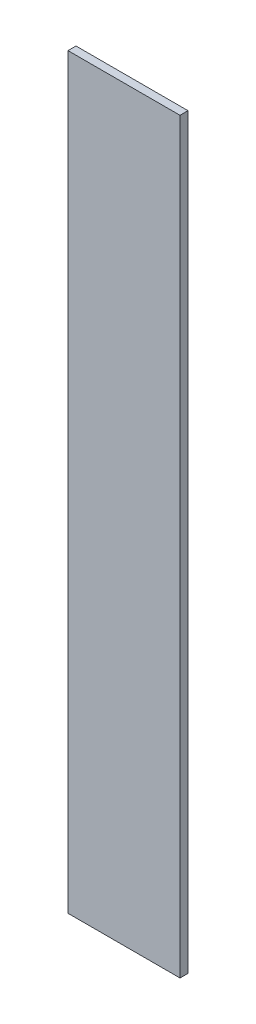
ISO-10303-21;
HEADER;
FILE_DESCRIPTION(('STEP AP214'),'2;1');
FILE_NAME('part.step','',(''),(''),'','','');
FILE_SCHEMA(('AUTOMOTIVE_DESIGN { 1 0 10303 214 1 1 1 1 }'));
ENDSEC;
DATA;
#1=APPLICATION_CONTEXT('core data for automotive mechanical design processes');
#2=APPLICATION_PROTOCOL_DEFINITION('international standard','automotive_design',2000,#1);
#3=PRODUCT_CONTEXT('',#1,'mechanical');
#4=PRODUCT('Part','Part','',(#3));
#5=PRODUCT_RELATED_PRODUCT_CATEGORY('part','',(#4));
#6=PRODUCT_DEFINITION_FORMATION('','',#4);
#7=PRODUCT_DEFINITION_CONTEXT('part definition',#1,'design');
#8=PRODUCT_DEFINITION('design','',#6,#7);
#9=PRODUCT_DEFINITION_SHAPE('','',#8);
#10=(LENGTH_UNIT() NAMED_UNIT(*) SI_UNIT(.MILLI.,.METRE.));
#11=(NAMED_UNIT(*) PLANE_ANGLE_UNIT() SI_UNIT($,.RADIAN.));
#12=(NAMED_UNIT(*) SI_UNIT($,.STERADIAN.) SOLID_ANGLE_UNIT());
#13=UNCERTAINTY_MEASURE_WITH_UNIT(LENGTH_MEASURE(1.E-05),#10,'distance_accuracy_value','');
#14=(GEOMETRIC_REPRESENTATION_CONTEXT(3) GLOBAL_UNCERTAINTY_ASSIGNED_CONTEXT((#13)) GLOBAL_UNIT_ASSIGNED_CONTEXT((#10,
#11,#12)) REPRESENTATION_CONTEXT('',''));
#15=CARTESIAN_POINT('',(0.,0.,0.));
#16=DIRECTION('',(0.,0.,1.));
#17=DIRECTION('',(1.,0.,0.));
#18=AXIS2_PLACEMENT_3D('',#15,#16,#17);
#19=CARTESIAN_POINT('',(0.,0.,6.35));
#20=DIRECTION('',(0.,1.,0.));
#21=DIRECTION('',(0.,0.,1.));
#22=AXIS2_PLACEMENT_3D('',#19,#20,#21);
#23=PLANE('',#22);
#24=DIRECTION('',(1.,0.,0.));
#25=VECTOR('',#24,1.);
#26=CARTESIAN_POINT('',(0.,0.,0.));
#27=LINE('',#26,#25);
#28=CARTESIAN_POINT('',(-88.9,0.,0.));
#29=VERTEX_POINT('',#28);
#30=CARTESIAN_POINT('',(0.,0.,0.));
#31=VERTEX_POINT('',#30);
#32=EDGE_CURVE('E113',#29,#31,#27,.T.);
#33=ORIENTED_EDGE('',*,*,#32,.T.);
#34=DIRECTION('',(0.,0.,-1.));
#35=VECTOR('',#34,1.);
#36=CARTESIAN_POINT('',(0.,0.,6.35));
#37=LINE('',#36,#35);
#38=CARTESIAN_POINT('',(0.,0.,6.35));
#39=VERTEX_POINT('',#38);
#40=EDGE_CURVE('E11',#39,#31,#37,.T.);
#41=ORIENTED_EDGE('',*,*,#40,.F.);
#42=DIRECTION('',(1.,0.,0.));
#43=VECTOR('',#42,1.);
#44=CARTESIAN_POINT('',(0.,0.,6.35));
#45=LINE('',#44,#43);
#46=CARTESIAN_POINT('',(-88.9,0.,6.35));
#47=VERTEX_POINT('',#46);
#48=EDGE_CURVE('E97',#47,#39,#45,.T.);
#49=ORIENTED_EDGE('',*,*,#48,.F.);
#50=DIRECTION('',(0.,0.,-1.));
#51=VECTOR('',#50,1.);
#52=CARTESIAN_POINT('',(-88.9,0.,6.35));
#53=LINE('',#52,#51);
#54=EDGE_CURVE('E109',#47,#29,#53,.T.);
#55=ORIENTED_EDGE('',*,*,#54,.T.);
#56=EDGE_LOOP('',(#33,#41,#49,#55));
#57=FACE_BOUND('',#56,.T.);
#58=ADVANCED_FACE('F45',(#57),#23,.F.);
#59=CARTESIAN_POINT('',(0.,0.,6.35));
#60=DIRECTION('',(-1.,0.,0.));
#61=DIRECTION('',(0.,0.,1.));
#62=AXIS2_PLACEMENT_3D('',#59,#60,#61);
#63=PLANE('',#62);
#64=DIRECTION('',(0.,1.,0.));
#65=VECTOR('',#64,1.);
#66=CARTESIAN_POINT('',(0.,0.,0.));
#67=LINE('',#66,#65);
#68=CARTESIAN_POINT('',(0.,593.09,0.));
#69=VERTEX_POINT('',#68);
#70=EDGE_CURVE('E102',#31,#69,#67,.T.);
#71=ORIENTED_EDGE('',*,*,#70,.T.);
#72=DIRECTION('',(0.,0.,-1.));
#73=VECTOR('',#72,1.);
#74=CARTESIAN_POINT('',(0.,593.09,6.35));
#75=LINE('',#74,#73);
#76=CARTESIAN_POINT('',(0.,593.09,6.35));
#77=VERTEX_POINT('',#76);
#78=EDGE_CURVE('E54',#77,#69,#75,.T.);
#79=ORIENTED_EDGE('',*,*,#78,.F.);
#80=DIRECTION('',(0.,1.,0.));
#81=VECTOR('',#80,1.);
#82=CARTESIAN_POINT('',(0.,0.,6.35));
#83=LINE('',#82,#81);
#84=EDGE_CURVE('E92',#39,#77,#83,.T.);
#85=ORIENTED_EDGE('',*,*,#84,.F.);
#86=ORIENTED_EDGE('',*,*,#40,.T.);
#87=EDGE_LOOP('',(#71,#79,#85,#86));
#88=FACE_BOUND('',#87,.T.);
#89=ADVANCED_FACE('F101',(#88),#63,.F.);
#90=CARTESIAN_POINT('',(0.,593.09,6.35));
#91=DIRECTION('',(0.,-1.,0.));
#92=DIRECTION('',(0.,0.,-1.));
#93=AXIS2_PLACEMENT_3D('',#90,#91,#92);
#94=PLANE('',#93);
#95=DIRECTION('',(-1.,0.,0.));
#96=VECTOR('',#95,1.);
#97=CARTESIAN_POINT('',(0.,593.09,0.));
#98=LINE('',#97,#96);
#99=CARTESIAN_POINT('',(-88.9,593.09,0.));
#100=VERTEX_POINT('',#99);
#101=EDGE_CURVE('E79',#69,#100,#98,.T.);
#102=ORIENTED_EDGE('',*,*,#101,.T.);
#103=DIRECTION('',(0.,0.,-1.));
#104=VECTOR('',#103,1.);
#105=CARTESIAN_POINT('',(-88.9,593.09,6.35));
#106=LINE('',#105,#104);
#107=CARTESIAN_POINT('',(-88.9,593.09,6.35));
#108=VERTEX_POINT('',#107);
#109=EDGE_CURVE('E104',#108,#100,#106,.T.);
#110=ORIENTED_EDGE('',*,*,#109,.F.);
#111=DIRECTION('',(-1.,0.,0.));
#112=VECTOR('',#111,1.);
#113=CARTESIAN_POINT('',(0.,593.09,6.35));
#114=LINE('',#113,#112);
#115=EDGE_CURVE('E95',#77,#108,#114,.T.);
#116=ORIENTED_EDGE('',*,*,#115,.F.);
#117=ORIENTED_EDGE('',*,*,#78,.T.);
#118=EDGE_LOOP('',(#102,#110,#116,#117));
#119=FACE_BOUND('',#118,.T.);
#120=ADVANCED_FACE('F105',(#119),#94,.F.);
#121=CARTESIAN_POINT('',(-88.9,0.,6.35));
#122=DIRECTION('',(1.,0.,0.));
#123=DIRECTION('',(0.,0.,-1.));
#124=AXIS2_PLACEMENT_3D('',#121,#122,#123);
#125=PLANE('',#124);
#126=DIRECTION('',(0.,-1.,0.));
#127=VECTOR('',#126,1.);
#128=CARTESIAN_POINT('',(-88.9,0.,0.));
#129=LINE('',#128,#127);
#130=EDGE_CURVE('E85',#100,#29,#129,.T.);
#131=ORIENTED_EDGE('',*,*,#130,.T.);
#132=ORIENTED_EDGE('',*,*,#54,.F.);
#133=DIRECTION('',(0.,-1.,0.));
#134=VECTOR('',#133,1.);
#135=CARTESIAN_POINT('',(-88.9,0.,6.35));
#136=LINE('',#135,#134);
#137=EDGE_CURVE('E62',#108,#47,#136,.T.);
#138=ORIENTED_EDGE('',*,*,#137,.F.);
#139=ORIENTED_EDGE('',*,*,#109,.T.);
#140=EDGE_LOOP('',(#131,#132,#138,#139));
#141=FACE_BOUND('',#140,.T.);
#142=ADVANCED_FACE('F126',(#141),#125,.F.);
#143=CARTESIAN_POINT('',(0.,0.,6.35));
#144=DIRECTION('',(0.,0.,-1.));
#145=DIRECTION('',(-1.,0.,0.));
#146=AXIS2_PLACEMENT_3D('',#143,#144,#145);
#147=PLANE('',#146);
#148=ORIENTED_EDGE('',*,*,#48,.T.);
#149=ORIENTED_EDGE('',*,*,#84,.T.);
#150=ORIENTED_EDGE('',*,*,#115,.T.);
#151=ORIENTED_EDGE('',*,*,#137,.T.);
#152=EDGE_LOOP('',(#148,#149,#150,#151));
#153=FACE_BOUND('',#152,.T.);
#154=ADVANCED_FACE('F93',(#153),#147,.F.);
#155=CARTESIAN_POINT('',(0.,0.,0.));
#156=DIRECTION('',(0.,0.,-1.));
#157=DIRECTION('',(-1.,0.,0.));
#158=AXIS2_PLACEMENT_3D('',#155,#156,#157);
#159=PLANE('',#158);
#160=ORIENTED_EDGE('',*,*,#32,.F.);
#161=ORIENTED_EDGE('',*,*,#130,.F.);
#162=ORIENTED_EDGE('',*,*,#101,.F.);
#163=ORIENTED_EDGE('',*,*,#70,.F.);
#164=EDGE_LOOP('',(#160,#161,#162,#163));
#165=FACE_BOUND('',#164,.T.);
#166=ADVANCED_FACE('F129',(#165),#159,.T.);
#167=CLOSED_SHELL('',(#58,#89,#120,#142,#154,#166));
#168=MANIFOLD_SOLID_BREP('B2',#167);
#169=ADVANCED_BREP_SHAPE_REPRESENTATION('',(#18,#168),#14);
#170=SHAPE_DEFINITION_REPRESENTATION(#9,#169);
ENDSEC;
END-ISO-10303-21;
